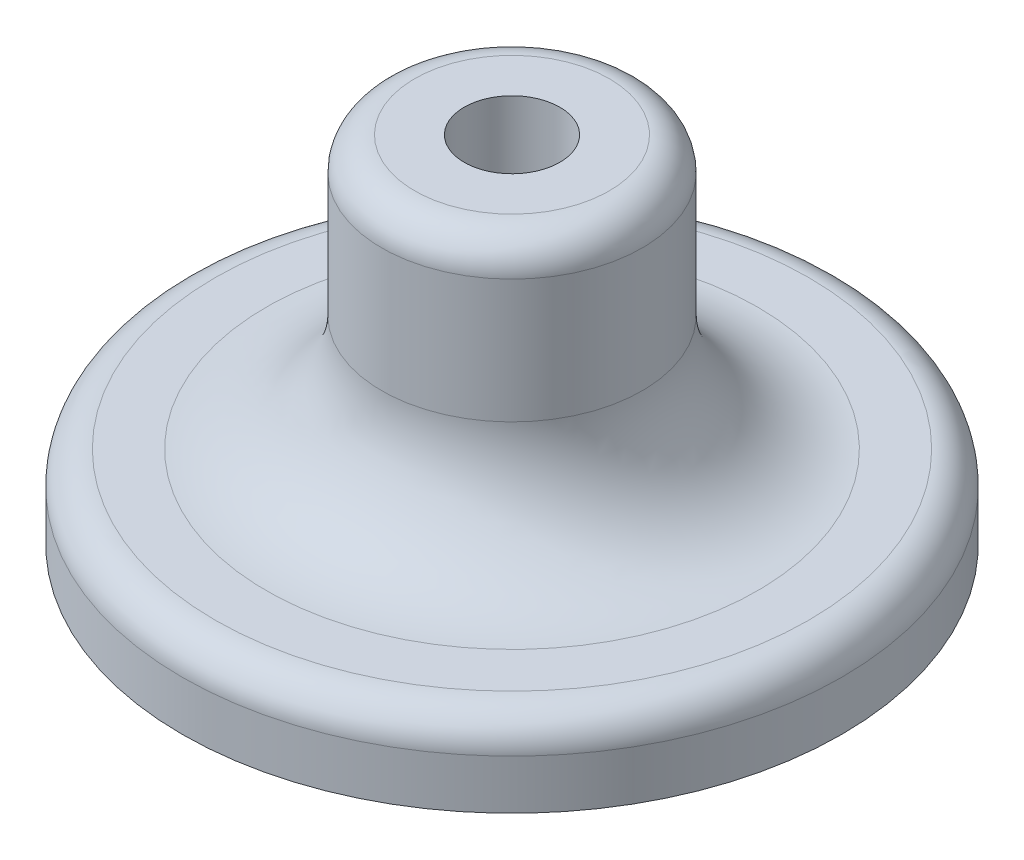
ISO-10303-21;
HEADER;
FILE_DESCRIPTION(('STEP AP214'),'2;1');
FILE_NAME('part.step','',(''),(''),'','','');
FILE_SCHEMA(('AUTOMOTIVE_DESIGN { 1 0 10303 214 1 1 1 1 }'));
ENDSEC;
DATA;
#1=APPLICATION_CONTEXT('core data for automotive mechanical design processes');
#2=APPLICATION_PROTOCOL_DEFINITION('international standard','automotive_design',2000,#1);
#3=PRODUCT_CONTEXT('',#1,'mechanical');
#4=PRODUCT('Part','Part','',(#3));
#5=PRODUCT_RELATED_PRODUCT_CATEGORY('part','',(#4));
#6=PRODUCT_DEFINITION_FORMATION('','',#4);
#7=PRODUCT_DEFINITION_CONTEXT('part definition',#1,'design');
#8=PRODUCT_DEFINITION('design','',#6,#7);
#9=PRODUCT_DEFINITION_SHAPE('','',#8);
#10=(LENGTH_UNIT() NAMED_UNIT(*) SI_UNIT(.MILLI.,.METRE.));
#11=(NAMED_UNIT(*) PLANE_ANGLE_UNIT() SI_UNIT($,.RADIAN.));
#12=(NAMED_UNIT(*) SI_UNIT($,.STERADIAN.) SOLID_ANGLE_UNIT());
#13=UNCERTAINTY_MEASURE_WITH_UNIT(LENGTH_MEASURE(1.E-05),#10,'distance_accuracy_value','');
#14=(GEOMETRIC_REPRESENTATION_CONTEXT(3) GLOBAL_UNCERTAINTY_ASSIGNED_CONTEXT((#13)) GLOBAL_UNIT_ASSIGNED_CONTEXT((#10,
#11,#12)) REPRESENTATION_CONTEXT('',''));
#15=CARTESIAN_POINT('',(0.,0.,0.));
#16=DIRECTION('',(0.,0.,1.));
#17=DIRECTION('',(1.,0.,0.));
#18=AXIS2_PLACEMENT_3D('',#15,#16,#17);
#19=CARTESIAN_POINT('',(0.,1.5,0.));
#20=DIRECTION('',(0.,-1.,0.));
#21=DIRECTION('',(0.,0.,-1.));
#22=AXIS2_PLACEMENT_3D('',#19,#20,#21);
#23=PLANE('',#22);
#24=CARTESIAN_POINT('',(0.,1.5,0.));
#25=DIRECTION('',(0.,-1.,0.));
#26=DIRECTION('',(0.,0.,-1.));
#27=AXIS2_PLACEMENT_3D('',#24,#25,#26);
#28=CIRCLE('',#27,2.9);
#29=CARTESIAN_POINT('',(0.,1.5,-2.9));
#30=VERTEX_POINT('',#29);
#31=EDGE_CURVE('E10',#30,#30,#28,.T.);
#32=ORIENTED_EDGE('',*,*,#31,.F.);
#33=EDGE_LOOP('',(#32));
#34=FACE_BOUND('',#33,.T.);
#35=ADVANCED_FACE('F31',(#34),#23,.F.);
#36=CARTESIAN_POINT('',(0.,0.,0.));
#37=DIRECTION('',(0.,-1.,0.));
#38=DIRECTION('',(0.,0.,-1.));
#39=AXIS2_PLACEMENT_3D('',#36,#37,#38);
#40=CYLINDRICAL_SURFACE('',#39,2.9);
#41=CARTESIAN_POINT('',(0.,21.5,0.));
#42=DIRECTION('',(0.,-1.,0.));
#43=DIRECTION('',(0.,0.,-1.));
#44=AXIS2_PLACEMENT_3D('',#41,#42,#43);
#45=CIRCLE('',#44,2.9);
#46=CARTESIAN_POINT('',(0.,21.5,-2.9));
#47=VERTEX_POINT('',#46);
#48=EDGE_CURVE('E37',#47,#47,#45,.T.);
#49=ORIENTED_EDGE('',*,*,#48,.F.);
#50=EDGE_LOOP('',(#49));
#51=FACE_BOUND('',#50,.T.);
#52=ORIENTED_EDGE('',*,*,#31,.T.);
#53=EDGE_LOOP('',(#52));
#54=FACE_BOUND('',#53,.T.);
#55=ADVANCED_FACE('F106',(#51,#54),#40,.F.);
#56=CARTESIAN_POINT('',(0.,21.5,2.9));
#57=DIRECTION('',(0.,-1.,0.));
#58=DIRECTION('',(0.,0.,-1.));
#59=AXIS2_PLACEMENT_3D('',#56,#57,#58);
#60=PLANE('',#59);
#61=CARTESIAN_POINT('',(0.,21.5,0.));
#62=DIRECTION('',(0.,-1.,0.));
#63=DIRECTION('',(0.,0.,-1.));
#64=AXIS2_PLACEMENT_3D('',#61,#62,#63);
#65=CIRCLE('',#64,5.89999999999999);
#66=CARTESIAN_POINT('',(0.,21.5,-5.89999999999999));
#67=VERTEX_POINT('',#66);
#68=EDGE_CURVE('E41',#67,#67,#65,.T.);
#69=ORIENTED_EDGE('',*,*,#68,.F.);
#70=EDGE_LOOP('',(#69));
#71=FACE_BOUND('',#70,.T.);
#72=ORIENTED_EDGE('',*,*,#48,.T.);
#73=EDGE_LOOP('',(#72));
#74=FACE_BOUND('',#73,.T.);
#75=ADVANCED_FACE('F101',(#71,#74),#60,.F.);
#76=CARTESIAN_POINT('',(0.,19.5,0.));
#77=DIRECTION('',(0.,-1.,0.));
#78=DIRECTION('',(0.,0.,-1.));
#79=AXIS2_PLACEMENT_3D('',#76,#77,#78);
#80=TOROIDAL_SURFACE('',#79,5.9,2.);
#81=CARTESIAN_POINT('',(0.,19.5,0.));
#82=DIRECTION('',(0.,-1.,0.));
#83=DIRECTION('',(0.,0.,-1.));
#84=AXIS2_PLACEMENT_3D('',#81,#82,#83);
#85=CIRCLE('',#84,7.9);
#86=CARTESIAN_POINT('',(0.,19.5,-7.9));
#87=VERTEX_POINT('',#86);
#88=EDGE_CURVE('E45',#87,#87,#85,.T.);
#89=ORIENTED_EDGE('',*,*,#88,.F.);
#90=EDGE_LOOP('',(#89));
#91=FACE_BOUND('',#90,.T.);
#92=ORIENTED_EDGE('',*,*,#68,.T.);
#93=EDGE_LOOP('',(#92));
#94=FACE_BOUND('',#93,.T.);
#95=ADVANCED_FACE('F95',(#91,#94),#80,.T.);
#96=CARTESIAN_POINT('',(0.,0.,0.));
#97=DIRECTION('',(0.,-1.,0.));
#98=DIRECTION('',(0.,0.,-1.));
#99=AXIS2_PLACEMENT_3D('',#96,#97,#98);
#100=CYLINDRICAL_SURFACE('',#99,7.9);
#101=CARTESIAN_POINT('',(0.,12.,0.));
#102=DIRECTION('',(0.,-1.,0.));
#103=DIRECTION('',(0.,0.,-1.));
#104=AXIS2_PLACEMENT_3D('',#101,#102,#103);
#105=CIRCLE('',#104,7.9);
#106=CARTESIAN_POINT('',(0.,12.,-7.9));
#107=VERTEX_POINT('',#106);
#108=EDGE_CURVE('E50',#107,#107,#105,.T.);
#109=ORIENTED_EDGE('',*,*,#108,.F.);
#110=EDGE_LOOP('',(#109));
#111=FACE_BOUND('',#110,.T.);
#112=ORIENTED_EDGE('',*,*,#88,.T.);
#113=EDGE_LOOP('',(#112));
#114=FACE_BOUND('',#113,.T.);
#115=ADVANCED_FACE('F89',(#111,#114),#100,.T.);
#116=CARTESIAN_POINT('',(0.,12.,0.));
#117=DIRECTION('',(0.,-1.,0.));
#118=DIRECTION('',(0.,0.,-1.));
#119=AXIS2_PLACEMENT_3D('',#116,#117,#118);
#120=TOROIDAL_SURFACE('',#119,14.9,7.);
#121=CARTESIAN_POINT('',(0.,5.,0.));
#122=DIRECTION('',(0.,-1.,0.));
#123=DIRECTION('',(0.,0.,-1.));
#124=AXIS2_PLACEMENT_3D('',#121,#122,#123);
#125=CIRCLE('',#124,14.9);
#126=CARTESIAN_POINT('',(0.,5.,-14.9));
#127=VERTEX_POINT('',#126);
#128=EDGE_CURVE('E53',#127,#127,#125,.T.);
#129=ORIENTED_EDGE('',*,*,#128,.F.);
#130=EDGE_LOOP('',(#129));
#131=FACE_BOUND('',#130,.T.);
#132=ORIENTED_EDGE('',*,*,#108,.T.);
#133=EDGE_LOOP('',(#132));
#134=FACE_BOUND('',#133,.T.);
#135=ADVANCED_FACE('F83',(#131,#134),#120,.F.);
#136=CARTESIAN_POINT('',(0.,5.,14.9));
#137=DIRECTION('',(0.,-1.,0.));
#138=DIRECTION('',(0.,0.,-1.));
#139=AXIS2_PLACEMENT_3D('',#136,#137,#138);
#140=PLANE('',#139);
#141=CARTESIAN_POINT('',(0.,5.,0.));
#142=DIRECTION('',(0.,-1.,0.));
#143=DIRECTION('',(0.,0.,-1.));
#144=AXIS2_PLACEMENT_3D('',#141,#142,#143);
#145=CIRCLE('',#144,18.);
#146=CARTESIAN_POINT('',(0.,5.,-18.));
#147=VERTEX_POINT('',#146);
#148=EDGE_CURVE('E56',#147,#147,#145,.T.);
#149=ORIENTED_EDGE('',*,*,#148,.F.);
#150=EDGE_LOOP('',(#149));
#151=FACE_BOUND('',#150,.T.);
#152=ORIENTED_EDGE('',*,*,#128,.T.);
#153=EDGE_LOOP('',(#152));
#154=FACE_BOUND('',#153,.T.);
#155=ADVANCED_FACE('F77',(#151,#154),#140,.F.);
#156=CARTESIAN_POINT('',(0.,3.,0.));
#157=DIRECTION('',(0.,-1.,0.));
#158=DIRECTION('',(0.,0.,-1.));
#159=AXIS2_PLACEMENT_3D('',#156,#157,#158);
#160=TOROIDAL_SURFACE('',#159,18.,2.);
#161=CARTESIAN_POINT('',(0.,2.99999999999998,0.));
#162=DIRECTION('',(0.,-1.,0.));
#163=DIRECTION('',(0.,0.,-1.));
#164=AXIS2_PLACEMENT_3D('',#161,#162,#163);
#165=CIRCLE('',#164,20.);
#166=CARTESIAN_POINT('',(0.,2.99999999999998,-20.));
#167=VERTEX_POINT('',#166);
#168=EDGE_CURVE('E59',#167,#167,#165,.T.);
#169=ORIENTED_EDGE('',*,*,#168,.F.);
#170=EDGE_LOOP('',(#169));
#171=FACE_BOUND('',#170,.T.);
#172=ORIENTED_EDGE('',*,*,#148,.T.);
#173=EDGE_LOOP('',(#172));
#174=FACE_BOUND('',#173,.T.);
#175=ADVANCED_FACE('F71',(#171,#174),#160,.T.);
#176=CARTESIAN_POINT('',(0.,0.,0.));
#177=DIRECTION('',(0.,-1.,0.));
#178=DIRECTION('',(0.,0.,-1.));
#179=AXIS2_PLACEMENT_3D('',#176,#177,#178);
#180=CYLINDRICAL_SURFACE('',#179,20.);
#181=CARTESIAN_POINT('',(0.,0.,0.));
#182=DIRECTION('',(0.,-1.,0.));
#183=DIRECTION('',(0.,0.,-1.));
#184=AXIS2_PLACEMENT_3D('',#181,#182,#183);
#185=CIRCLE('',#184,20.);
#186=CARTESIAN_POINT('',(0.,0.,-20.));
#187=VERTEX_POINT('',#186);
#188=EDGE_CURVE('E62',#187,#187,#185,.T.);
#189=ORIENTED_EDGE('',*,*,#188,.F.);
#190=EDGE_LOOP('',(#189));
#191=FACE_BOUND('',#190,.T.);
#192=ORIENTED_EDGE('',*,*,#168,.T.);
#193=EDGE_LOOP('',(#192));
#194=FACE_BOUND('',#193,.T.);
#195=ADVANCED_FACE('F68',(#191,#194),#180,.T.);
#196=CARTESIAN_POINT('',(0.,0.,0.));
#197=DIRECTION('',(0.,1.,0.));
#198=DIRECTION('',(0.,0.,1.));
#199=AXIS2_PLACEMENT_3D('',#196,#197,#198);
#200=PLANE('',#199);
#201=ORIENTED_EDGE('',*,*,#188,.T.);
#202=EDGE_LOOP('',(#201));
#203=FACE_BOUND('',#202,.T.);
#204=ADVANCED_FACE('F66',(#203),#200,.F.);
#205=CLOSED_SHELL('',(#35,#55,#75,#95,#115,#135,#155,#175,#195,#204));
#206=MANIFOLD_SOLID_BREP('B2',#205);
#207=ADVANCED_BREP_SHAPE_REPRESENTATION('',(#18,#206),#14);
#208=SHAPE_DEFINITION_REPRESENTATION(#9,#207);
ENDSEC;
END-ISO-10303-21;
